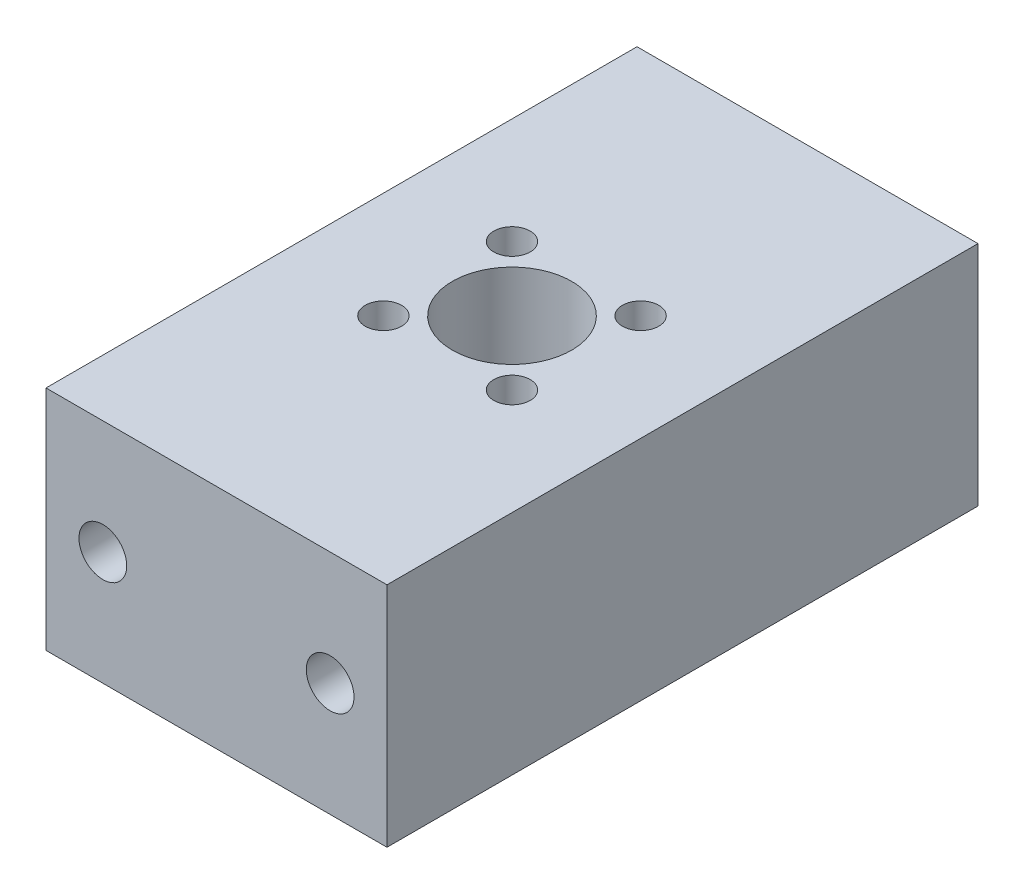
ISO-10303-21;
HEADER;
FILE_DESCRIPTION(('STEP AP214'),'2;1');
FILE_NAME('part.step','',(''),(''),'','','');
FILE_SCHEMA(('AUTOMOTIVE_DESIGN { 1 0 10303 214 1 1 1 1 }'));
ENDSEC;
DATA;
#1=APPLICATION_CONTEXT('core data for automotive mechanical design processes');
#2=APPLICATION_PROTOCOL_DEFINITION('international standard','automotive_design',2000,#1);
#3=PRODUCT_CONTEXT('',#1,'mechanical');
#4=PRODUCT('Part','Part','',(#3));
#5=PRODUCT_RELATED_PRODUCT_CATEGORY('part','',(#4));
#6=PRODUCT_DEFINITION_FORMATION('','',#4);
#7=PRODUCT_DEFINITION_CONTEXT('part definition',#1,'design');
#8=PRODUCT_DEFINITION('design','',#6,#7);
#9=PRODUCT_DEFINITION_SHAPE('','',#8);
#10=(LENGTH_UNIT() NAMED_UNIT(*) SI_UNIT(.MILLI.,.METRE.));
#11=(NAMED_UNIT(*) PLANE_ANGLE_UNIT() SI_UNIT($,.RADIAN.));
#12=(NAMED_UNIT(*) SI_UNIT($,.STERADIAN.) SOLID_ANGLE_UNIT());
#13=UNCERTAINTY_MEASURE_WITH_UNIT(LENGTH_MEASURE(1.E-05),#10,'distance_accuracy_value','');
#14=(GEOMETRIC_REPRESENTATION_CONTEXT(3) GLOBAL_UNCERTAINTY_ASSIGNED_CONTEXT((#13)) GLOBAL_UNIT_ASSIGNED_CONTEXT((#10,
#11,#12)) REPRESENTATION_CONTEXT('',''));
#15=CARTESIAN_POINT('',(0.,0.,0.));
#16=DIRECTION('',(0.,0.,1.));
#17=DIRECTION('',(1.,0.,0.));
#18=AXIS2_PLACEMENT_3D('',#15,#16,#17);
#19=CARTESIAN_POINT('',(0.,0.,52.));
#20=DIRECTION('',(0.,0.,-1.));
#21=DIRECTION('',(-1.,0.,0.));
#22=AXIS2_PLACEMENT_3D('',#19,#20,#21);
#23=PLANE('',#22);
#24=DIRECTION('',(0.,-1.,0.));
#25=VECTOR('',#24,1.);
#26=CARTESIAN_POINT('',(0.,0.,52.));
#27=LINE('',#26,#25);
#28=CARTESIAN_POINT('',(0.,20.,52.));
#29=VERTEX_POINT('',#28);
#30=CARTESIAN_POINT('',(0.,0.,52.));
#31=VERTEX_POINT('',#30);
#32=EDGE_CURVE('E92',#29,#31,#27,.T.);
#33=ORIENTED_EDGE('',*,*,#32,.T.);
#34=DIRECTION('',(1.,0.,0.));
#35=VECTOR('',#34,1.);
#36=CARTESIAN_POINT('',(0.,0.,52.));
#37=LINE('',#36,#35);
#38=CARTESIAN_POINT('',(30.,0.,52.));
#39=VERTEX_POINT('',#38);
#40=EDGE_CURVE('E87',#31,#39,#37,.T.);
#41=ORIENTED_EDGE('',*,*,#40,.T.);
#42=DIRECTION('',(0.,1.,0.));
#43=VECTOR('',#42,1.);
#44=CARTESIAN_POINT('',(30.,0.,52.));
#45=LINE('',#44,#43);
#46=CARTESIAN_POINT('',(30.,20.,52.));
#47=VERTEX_POINT('',#46);
#48=EDGE_CURVE('E90',#39,#47,#45,.T.);
#49=ORIENTED_EDGE('',*,*,#48,.T.);
#50=DIRECTION('',(-1.,0.,0.));
#51=VECTOR('',#50,1.);
#52=CARTESIAN_POINT('',(0.,20.,52.));
#53=LINE('',#52,#51);
#54=EDGE_CURVE('E57',#47,#29,#53,.T.);
#55=ORIENTED_EDGE('',*,*,#54,.T.);
#56=EDGE_LOOP('',(#33,#41,#49,#55));
#57=FACE_BOUND('',#56,.T.);
#58=CARTESIAN_POINT('',(5.,10.,52.));
#59=DIRECTION('',(0.,0.,1.));
#60=DIRECTION('',(1.,0.,0.));
#61=AXIS2_PLACEMENT_3D('',#58,#59,#60);
#62=CIRCLE('',#61,2.1);
#63=CARTESIAN_POINT('',(2.9,10.,52.));
#64=VERTEX_POINT('',#63);
#65=EDGE_CURVE('E112',#64,#64,#62,.T.);
#66=ORIENTED_EDGE('',*,*,#65,.F.);
#67=EDGE_LOOP('',(#66));
#68=FACE_BOUND('',#67,.T.);
#69=CARTESIAN_POINT('',(25.,10.,52.));
#70=DIRECTION('',(0.,0.,1.));
#71=DIRECTION('',(1.,0.,0.));
#72=AXIS2_PLACEMENT_3D('',#69,#70,#71);
#73=CIRCLE('',#72,2.1);
#74=CARTESIAN_POINT('',(22.9,10.,52.));
#75=VERTEX_POINT('',#74);
#76=EDGE_CURVE('E134',#75,#75,#73,.T.);
#77=ORIENTED_EDGE('',*,*,#76,.F.);
#78=EDGE_LOOP('',(#77));
#79=FACE_BOUND('',#78,.T.);
#80=ADVANCED_FACE('F39',(#57,#68,#79),#23,.F.);
#81=CARTESIAN_POINT('',(0.,0.,0.));
#82=DIRECTION('',(0.,0.,-1.));
#83=DIRECTION('',(-1.,0.,0.));
#84=AXIS2_PLACEMENT_3D('',#81,#82,#83);
#85=PLANE('',#84);
#86=CARTESIAN_POINT('',(5.,10.,0.));
#87=DIRECTION('',(0.,0.,1.));
#88=DIRECTION('',(1.,0.,0.));
#89=AXIS2_PLACEMENT_3D('',#86,#87,#88);
#90=CIRCLE('',#89,2.1);
#91=CARTESIAN_POINT('',(2.9,10.,0.));
#92=VERTEX_POINT('',#91);
#93=EDGE_CURVE('E130',#92,#92,#90,.T.);
#94=ORIENTED_EDGE('',*,*,#93,.T.);
#95=EDGE_LOOP('',(#94));
#96=FACE_BOUND('',#95,.T.);
#97=DIRECTION('',(0.,-1.,0.));
#98=VECTOR('',#97,1.);
#99=CARTESIAN_POINT('',(0.,0.,0.));
#100=LINE('',#99,#98);
#101=CARTESIAN_POINT('',(0.,20.,0.));
#102=VERTEX_POINT('',#101);
#103=CARTESIAN_POINT('',(0.,0.,0.));
#104=VERTEX_POINT('',#103);
#105=EDGE_CURVE('E108',#102,#104,#100,.T.);
#106=ORIENTED_EDGE('',*,*,#105,.F.);
#107=DIRECTION('',(-1.,0.,0.));
#108=VECTOR('',#107,1.);
#109=CARTESIAN_POINT('',(0.,20.,0.));
#110=LINE('',#109,#108);
#111=CARTESIAN_POINT('',(30.,20.,0.));
#112=VERTEX_POINT('',#111);
#113=EDGE_CURVE('E80',#112,#102,#110,.T.);
#114=ORIENTED_EDGE('',*,*,#113,.F.);
#115=DIRECTION('',(0.,1.,0.));
#116=VECTOR('',#115,1.);
#117=CARTESIAN_POINT('',(30.,0.,0.));
#118=LINE('',#117,#116);
#119=CARTESIAN_POINT('',(30.,0.,0.));
#120=VERTEX_POINT('',#119);
#121=EDGE_CURVE('E74',#120,#112,#118,.T.);
#122=ORIENTED_EDGE('',*,*,#121,.F.);
#123=DIRECTION('',(1.,0.,0.));
#124=VECTOR('',#123,1.);
#125=CARTESIAN_POINT('',(0.,0.,0.));
#126=LINE('',#125,#124);
#127=EDGE_CURVE('E97',#104,#120,#126,.T.);
#128=ORIENTED_EDGE('',*,*,#127,.F.);
#129=EDGE_LOOP('',(#106,#114,#122,#128));
#130=FACE_BOUND('',#129,.T.);
#131=CARTESIAN_POINT('',(25.,10.,0.));
#132=DIRECTION('',(0.,0.,1.));
#133=DIRECTION('',(1.,0.,0.));
#134=AXIS2_PLACEMENT_3D('',#131,#132,#133);
#135=CIRCLE('',#134,2.1);
#136=CARTESIAN_POINT('',(22.9,10.,0.));
#137=VERTEX_POINT('',#136);
#138=EDGE_CURVE('E138',#137,#137,#135,.T.);
#139=ORIENTED_EDGE('',*,*,#138,.T.);
#140=EDGE_LOOP('',(#139));
#141=FACE_BOUND('',#140,.T.);
#142=ADVANCED_FACE('F125',(#96,#130,#141),#85,.T.);
#143=CARTESIAN_POINT('',(0.,0.,52.));
#144=DIRECTION('',(1.,0.,0.));
#145=DIRECTION('',(0.,0.,-1.));
#146=AXIS2_PLACEMENT_3D('',#143,#144,#145);
#147=PLANE('',#146);
#148=ORIENTED_EDGE('',*,*,#105,.T.);
#149=DIRECTION('',(0.,0.,-1.));
#150=VECTOR('',#149,1.);
#151=CARTESIAN_POINT('',(0.,0.,52.));
#152=LINE('',#151,#150);
#153=EDGE_CURVE('E11',#31,#104,#152,.T.);
#154=ORIENTED_EDGE('',*,*,#153,.F.);
#155=ORIENTED_EDGE('',*,*,#32,.F.);
#156=DIRECTION('',(0.,0.,-1.));
#157=VECTOR('',#156,1.);
#158=CARTESIAN_POINT('',(0.,20.,52.));
#159=LINE('',#158,#157);
#160=EDGE_CURVE('E104',#29,#102,#159,.T.);
#161=ORIENTED_EDGE('',*,*,#160,.T.);
#162=EDGE_LOOP('',(#148,#154,#155,#161));
#163=FACE_BOUND('',#162,.T.);
#164=ADVANCED_FACE('F41',(#163),#147,.F.);
#165=CARTESIAN_POINT('',(0.,0.,52.));
#166=DIRECTION('',(0.,1.,0.));
#167=DIRECTION('',(-1.,0.,0.));
#168=AXIS2_PLACEMENT_3D('',#165,#166,#167);
#169=PLANE('',#168);
#170=CARTESIAN_POINT('',(20.6568542494924,0.,20.3431457505076));
#171=DIRECTION('',(0.,1.,0.));
#172=DIRECTION('',(0.,0.,1.));
#173=AXIS2_PLACEMENT_3D('',#170,#171,#172);
#174=CIRCLE('',#173,1.6);
#175=CARTESIAN_POINT('',(20.6568542494924,0.,21.9431457505076));
#176=VERTEX_POINT('',#175);
#177=EDGE_CURVE('E158',#176,#176,#174,.T.);
#178=ORIENTED_EDGE('',*,*,#177,.T.);
#179=EDGE_LOOP('',(#178));
#180=FACE_BOUND('',#179,.T.);
#181=CARTESIAN_POINT('',(20.6568542494924,0.,31.6568542494924));
#182=DIRECTION('',(0.,1.,0.));
#183=DIRECTION('',(0.,0.,1.));
#184=AXIS2_PLACEMENT_3D('',#181,#182,#183);
#185=CIRCLE('',#184,1.6);
#186=CARTESIAN_POINT('',(20.6568542494924,0.,33.2568542494924));
#187=VERTEX_POINT('',#186);
#188=EDGE_CURVE('E166',#187,#187,#185,.T.);
#189=ORIENTED_EDGE('',*,*,#188,.T.);
#190=EDGE_LOOP('',(#189));
#191=FACE_BOUND('',#190,.T.);
#192=CARTESIAN_POINT('',(9.34314575050761,0.,20.3431457505076));
#193=DIRECTION('',(0.,1.,0.));
#194=DIRECTION('',(0.,0.,1.));
#195=AXIS2_PLACEMENT_3D('',#192,#193,#194);
#196=CIRCLE('',#195,1.6);
#197=CARTESIAN_POINT('',(9.34314575050761,0.,21.9431457505076));
#198=VERTEX_POINT('',#197);
#199=EDGE_CURVE('E174',#198,#198,#196,.T.);
#200=ORIENTED_EDGE('',*,*,#199,.T.);
#201=EDGE_LOOP('',(#200));
#202=FACE_BOUND('',#201,.T.);
#203=CARTESIAN_POINT('',(9.34314575050761,0.,31.6568542494924));
#204=DIRECTION('',(0.,1.,0.));
#205=DIRECTION('',(0.,0.,1.));
#206=AXIS2_PLACEMENT_3D('',#203,#204,#205);
#207=CIRCLE('',#206,1.6);
#208=CARTESIAN_POINT('',(9.34314575050761,0.,33.2568542494924));
#209=VERTEX_POINT('',#208);
#210=EDGE_CURVE('E150',#209,#209,#207,.T.);
#211=ORIENTED_EDGE('',*,*,#210,.T.);
#212=EDGE_LOOP('',(#211));
#213=FACE_BOUND('',#212,.T.);
#214=CARTESIAN_POINT('',(15.,0.,26.));
#215=DIRECTION('',(0.,1.,0.));
#216=DIRECTION('',(0.,0.,1.));
#217=AXIS2_PLACEMENT_3D('',#214,#215,#216);
#218=CIRCLE('',#217,5.25);
#219=CARTESIAN_POINT('',(15.,0.,31.25));
#220=VERTEX_POINT('',#219);
#221=EDGE_CURVE('E142',#220,#220,#218,.T.);
#222=ORIENTED_EDGE('',*,*,#221,.T.);
#223=EDGE_LOOP('',(#222));
#224=FACE_BOUND('',#223,.T.);
#225=ORIENTED_EDGE('',*,*,#127,.T.);
#226=DIRECTION('',(0.,0.,-1.));
#227=VECTOR('',#226,1.);
#228=CARTESIAN_POINT('',(30.,0.,52.));
#229=LINE('',#228,#227);
#230=EDGE_CURVE('E49',#39,#120,#229,.T.);
#231=ORIENTED_EDGE('',*,*,#230,.F.);
#232=ORIENTED_EDGE('',*,*,#40,.F.);
#233=ORIENTED_EDGE('',*,*,#153,.T.);
#234=EDGE_LOOP('',(#225,#231,#232,#233));
#235=FACE_BOUND('',#234,.T.);
#236=ADVANCED_FACE('F96',(#180,#191,#202,#213,#224,#235),#169,.F.);
#237=CARTESIAN_POINT('',(30.,0.,52.));
#238=DIRECTION('',(-1.,0.,0.));
#239=DIRECTION('',(0.,-1.,0.));
#240=AXIS2_PLACEMENT_3D('',#237,#238,#239);
#241=PLANE('',#240);
#242=ORIENTED_EDGE('',*,*,#121,.T.);
#243=DIRECTION('',(0.,0.,-1.));
#244=VECTOR('',#243,1.);
#245=CARTESIAN_POINT('',(30.,20.,52.));
#246=LINE('',#245,#244);
#247=EDGE_CURVE('E99',#47,#112,#246,.T.);
#248=ORIENTED_EDGE('',*,*,#247,.F.);
#249=ORIENTED_EDGE('',*,*,#48,.F.);
#250=ORIENTED_EDGE('',*,*,#230,.T.);
#251=EDGE_LOOP('',(#242,#248,#249,#250));
#252=FACE_BOUND('',#251,.T.);
#253=ADVANCED_FACE('F100',(#252),#241,.F.);
#254=CARTESIAN_POINT('',(0.,20.,52.));
#255=DIRECTION('',(0.,-1.,0.));
#256=DIRECTION('',(1.,0.,0.));
#257=AXIS2_PLACEMENT_3D('',#254,#255,#256);
#258=PLANE('',#257);
#259=CARTESIAN_POINT('',(20.6568542494924,20.,20.3431457505076));
#260=DIRECTION('',(0.,1.,0.));
#261=DIRECTION('',(0.,0.,1.));
#262=AXIS2_PLACEMENT_3D('',#259,#260,#261);
#263=CIRCLE('',#262,1.6);
#264=CARTESIAN_POINT('',(20.6568542494924,20.,21.9431457505076));
#265=VERTEX_POINT('',#264);
#266=EDGE_CURVE('E154',#265,#265,#263,.T.);
#267=ORIENTED_EDGE('',*,*,#266,.F.);
#268=EDGE_LOOP('',(#267));
#269=FACE_BOUND('',#268,.T.);
#270=CARTESIAN_POINT('',(20.6568542494924,20.,31.6568542494924));
#271=DIRECTION('',(0.,1.,0.));
#272=DIRECTION('',(0.,0.,1.));
#273=AXIS2_PLACEMENT_3D('',#270,#271,#272);
#274=CIRCLE('',#273,1.6);
#275=CARTESIAN_POINT('',(20.6568542494924,20.,33.2568542494924));
#276=VERTEX_POINT('',#275);
#277=EDGE_CURVE('E162',#276,#276,#274,.T.);
#278=ORIENTED_EDGE('',*,*,#277,.F.);
#279=EDGE_LOOP('',(#278));
#280=FACE_BOUND('',#279,.T.);
#281=CARTESIAN_POINT('',(9.34314575050761,20.,20.3431457505076));
#282=DIRECTION('',(0.,1.,0.));
#283=DIRECTION('',(0.,0.,1.));
#284=AXIS2_PLACEMENT_3D('',#281,#282,#283);
#285=CIRCLE('',#284,1.6);
#286=CARTESIAN_POINT('',(9.34314575050761,20.,21.9431457505076));
#287=VERTEX_POINT('',#286);
#288=EDGE_CURVE('E170',#287,#287,#285,.T.);
#289=ORIENTED_EDGE('',*,*,#288,.F.);
#290=EDGE_LOOP('',(#289));
#291=FACE_BOUND('',#290,.T.);
#292=CARTESIAN_POINT('',(9.34314575050761,20.,31.6568542494924));
#293=DIRECTION('',(0.,1.,0.));
#294=DIRECTION('',(0.,0.,1.));
#295=AXIS2_PLACEMENT_3D('',#292,#293,#294);
#296=CIRCLE('',#295,1.6);
#297=CARTESIAN_POINT('',(9.34314575050761,20.,33.2568542494924));
#298=VERTEX_POINT('',#297);
#299=EDGE_CURVE('E178',#298,#298,#296,.T.);
#300=ORIENTED_EDGE('',*,*,#299,.F.);
#301=EDGE_LOOP('',(#300));
#302=FACE_BOUND('',#301,.T.);
#303=CARTESIAN_POINT('',(15.,20.,26.));
#304=DIRECTION('',(0.,1.,0.));
#305=DIRECTION('',(0.,0.,1.));
#306=AXIS2_PLACEMENT_3D('',#303,#304,#305);
#307=CIRCLE('',#306,5.25);
#308=CARTESIAN_POINT('',(15.,20.,31.25));
#309=VERTEX_POINT('',#308);
#310=EDGE_CURVE('E146',#309,#309,#307,.T.);
#311=ORIENTED_EDGE('',*,*,#310,.F.);
#312=EDGE_LOOP('',(#311));
#313=FACE_BOUND('',#312,.T.);
#314=ORIENTED_EDGE('',*,*,#113,.T.);
#315=ORIENTED_EDGE('',*,*,#160,.F.);
#316=ORIENTED_EDGE('',*,*,#54,.F.);
#317=ORIENTED_EDGE('',*,*,#247,.T.);
#318=EDGE_LOOP('',(#314,#315,#316,#317));
#319=FACE_BOUND('',#318,.T.);
#320=ADVANCED_FACE('F122',(#269,#280,#291,#302,#313,#319),#258,.F.);
#321=CARTESIAN_POINT('',(5.,10.,52.));
#322=DIRECTION('',(0.,0.,-1.));
#323=DIRECTION('',(-1.,0.,0.));
#324=AXIS2_PLACEMENT_3D('',#321,#322,#323);
#325=CYLINDRICAL_SURFACE('',#324,2.1);
#326=CARTESIAN_POINT('',(2.9,10.,52.));
#327=CARTESIAN_POINT('',(2.9,10.,51.4583333333333));
#328=CARTESIAN_POINT('',(2.9,10.,50.9166666666667));
#329=CARTESIAN_POINT('',(2.9,10.,49.8333333333333));
#330=CARTESIAN_POINT('',(2.9,10.,49.2916666666667));
#331=CARTESIAN_POINT('',(2.9,10.,48.2083333333333));
#332=CARTESIAN_POINT('',(2.9,10.,47.6666666666667));
#333=CARTESIAN_POINT('',(2.9,10.,46.5833333333333));
#334=CARTESIAN_POINT('',(2.9,10.,46.0416666666667));
#335=CARTESIAN_POINT('',(2.9,10.,44.9583333333333));
#336=CARTESIAN_POINT('',(2.9,10.,44.4166666666667));
#337=CARTESIAN_POINT('',(2.9,10.,43.3333333333333));
#338=CARTESIAN_POINT('',(2.9,10.,42.7916666666667));
#339=CARTESIAN_POINT('',(2.9,10.,41.7083333333333));
#340=CARTESIAN_POINT('',(2.9,10.,41.1666666666667));
#341=CARTESIAN_POINT('',(2.9,10.,40.0833333333333));
#342=CARTESIAN_POINT('',(2.9,10.,39.5416666666667));
#343=CARTESIAN_POINT('',(2.9,10.,38.4583333333333));
#344=CARTESIAN_POINT('',(2.9,10.,37.9166666666667));
#345=CARTESIAN_POINT('',(2.9,10.,36.8333333333333));
#346=CARTESIAN_POINT('',(2.9,10.,36.2916666666667));
#347=CARTESIAN_POINT('',(2.9,10.,35.2083333333333));
#348=CARTESIAN_POINT('',(2.9,10.,34.6666666666667));
#349=CARTESIAN_POINT('',(2.9,10.,33.5833333333333));
#350=CARTESIAN_POINT('',(2.9,10.,33.0416666666667));
#351=CARTESIAN_POINT('',(2.9,10.,31.9583333333333));
#352=CARTESIAN_POINT('',(2.9,10.,31.4166666666667));
#353=CARTESIAN_POINT('',(2.9,10.,30.3333333333333));
#354=CARTESIAN_POINT('',(2.9,10.,29.7916666666667));
#355=CARTESIAN_POINT('',(2.9,10.,28.7083333333333));
#356=CARTESIAN_POINT('',(2.9,10.,28.1666666666667));
#357=CARTESIAN_POINT('',(2.9,10.,27.0833333333333));
#358=CARTESIAN_POINT('',(2.9,10.,26.5416666666667));
#359=CARTESIAN_POINT('',(2.9,10.,25.4583333333333));
#360=CARTESIAN_POINT('',(2.9,10.,24.9166666666667));
#361=CARTESIAN_POINT('',(2.9,10.,23.8333333333333));
#362=CARTESIAN_POINT('',(2.9,10.,23.2916666666667));
#363=CARTESIAN_POINT('',(2.9,10.,22.2083333333333));
#364=CARTESIAN_POINT('',(2.9,10.,21.6666666666667));
#365=CARTESIAN_POINT('',(2.9,10.,20.5833333333333));
#366=CARTESIAN_POINT('',(2.9,10.,20.0416666666667));
#367=CARTESIAN_POINT('',(2.9,10.,18.9583333333333));
#368=CARTESIAN_POINT('',(2.9,10.,18.4166666666667));
#369=CARTESIAN_POINT('',(2.9,10.,17.3333333333333));
#370=CARTESIAN_POINT('',(2.9,10.,16.7916666666667));
#371=CARTESIAN_POINT('',(2.9,10.,15.7083333333333));
#372=CARTESIAN_POINT('',(2.9,10.,15.1666666666667));
#373=CARTESIAN_POINT('',(2.9,10.,14.0833333333333));
#374=CARTESIAN_POINT('',(2.9,10.,13.5416666666667));
#375=CARTESIAN_POINT('',(2.9,10.,12.4583333333333));
#376=CARTESIAN_POINT('',(2.9,10.,11.9166666666667));
#377=CARTESIAN_POINT('',(2.9,10.,10.8333333333333));
#378=CARTESIAN_POINT('',(2.9,10.,10.2916666666667));
#379=CARTESIAN_POINT('',(2.9,10.,9.20833333333333));
#380=CARTESIAN_POINT('',(2.9,10.,8.66666666666667));
#381=CARTESIAN_POINT('',(2.9,10.,7.58333333333333));
#382=CARTESIAN_POINT('',(2.9,10.,7.04166666666667));
#383=CARTESIAN_POINT('',(2.9,10.,5.95833333333333));
#384=CARTESIAN_POINT('',(2.9,10.,5.41666666666667));
#385=CARTESIAN_POINT('',(2.9,10.,4.33333333333333));
#386=CARTESIAN_POINT('',(2.9,10.,3.79166666666667));
#387=CARTESIAN_POINT('',(2.9,10.,2.70833333333334));
#388=CARTESIAN_POINT('',(2.9,10.,2.16666666666667));
#389=CARTESIAN_POINT('',(2.9,10.,1.08333333333333));
#390=CARTESIAN_POINT('',(2.9,10.,0.541666666666667));
#391=CARTESIAN_POINT('',(2.9,10.,0.));
#392=B_SPLINE_CURVE_WITH_KNOTS('',3,(#326,#327,#328,#329,#330,#331,#332,#333,#334,#335,#336,
#337,#338,#339,#340,#341,#342,#343,#344,#345,#346,#347,#348,#349,#350,#351,#352,#353,#354,#355,
#356,#357,#358,#359,#360,#361,#362,#363,#364,#365,#366,#367,#368,#369,#370,#371,#372,#373,#374,
#375,#376,#377,#378,#379,#380,#381,#382,#383,#384,#385,#386,#387,#388,#389,#390,#391),
.UNSPECIFIED.,.F.,.F.,(4,2,2,2,2,2,2,2,2,2,2,2,2,2,2,2,2,2,2,2,2,2,2,2,2,2,2,2,2,2,2,2,4),(0.,
1.625,3.25,4.875,6.50000000000001,8.125,9.75,11.375,13.,14.625,16.25,17.875,19.5,21.125,22.75,
24.375,26.,27.625,29.25,30.875,32.5,34.125,35.75,37.375,39.,40.625,42.25,43.875,45.5,47.125,
48.75,50.375,52.),.UNSPECIFIED.);
#393=EDGE_CURVE('BSEAM198',#64,#92,#392,.T.);
#394=ORIENTED_EDGE('',*,*,#65,.T.);
#395=ORIENTED_EDGE('',*,*,#93,.F.);
#396=ORIENTED_EDGE('',*,*,#393,.T.);
#397=ORIENTED_EDGE('',*,*,#393,.F.);
#398=EDGE_LOOP('',(#394,#396,#395,#397));
#399=FACE_BOUND('',#398,.T.);
#400=ADVANCED_FACE('F198',(#399),#325,.F.);
#401=CARTESIAN_POINT('',(25.,10.,52.));
#402=DIRECTION('',(0.,0.,-1.));
#403=DIRECTION('',(-1.,0.,0.));
#404=AXIS2_PLACEMENT_3D('',#401,#402,#403);
#405=CYLINDRICAL_SURFACE('',#404,2.1);
#406=CARTESIAN_POINT('',(22.9,10.,52.));
#407=CARTESIAN_POINT('',(22.9,10.,51.4583333333333));
#408=CARTESIAN_POINT('',(22.9,10.,50.9166666666667));
#409=CARTESIAN_POINT('',(22.9,10.,49.8333333333333));
#410=CARTESIAN_POINT('',(22.9,10.,49.2916666666667));
#411=CARTESIAN_POINT('',(22.9,10.,48.2083333333333));
#412=CARTESIAN_POINT('',(22.9,10.,47.6666666666667));
#413=CARTESIAN_POINT('',(22.9,10.,46.5833333333333));
#414=CARTESIAN_POINT('',(22.9,10.,46.0416666666667));
#415=CARTESIAN_POINT('',(22.9,10.,44.9583333333333));
#416=CARTESIAN_POINT('',(22.9,10.,44.4166666666667));
#417=CARTESIAN_POINT('',(22.9,10.,43.3333333333333));
#418=CARTESIAN_POINT('',(22.9,10.,42.7916666666667));
#419=CARTESIAN_POINT('',(22.9,10.,41.7083333333333));
#420=CARTESIAN_POINT('',(22.9,10.,41.1666666666667));
#421=CARTESIAN_POINT('',(22.9,10.,40.0833333333333));
#422=CARTESIAN_POINT('',(22.9,10.,39.5416666666667));
#423=CARTESIAN_POINT('',(22.9,10.,38.4583333333333));
#424=CARTESIAN_POINT('',(22.9,10.,37.9166666666667));
#425=CARTESIAN_POINT('',(22.9,10.,36.8333333333333));
#426=CARTESIAN_POINT('',(22.9,10.,36.2916666666667));
#427=CARTESIAN_POINT('',(22.9,10.,35.2083333333333));
#428=CARTESIAN_POINT('',(22.9,10.,34.6666666666667));
#429=CARTESIAN_POINT('',(22.9,10.,33.5833333333333));
#430=CARTESIAN_POINT('',(22.9,10.,33.0416666666667));
#431=CARTESIAN_POINT('',(22.9,10.,31.9583333333333));
#432=CARTESIAN_POINT('',(22.9,10.,31.4166666666667));
#433=CARTESIAN_POINT('',(22.9,10.,30.3333333333333));
#434=CARTESIAN_POINT('',(22.9,10.,29.7916666666667));
#435=CARTESIAN_POINT('',(22.9,10.,28.7083333333333));
#436=CARTESIAN_POINT('',(22.9,10.,28.1666666666667));
#437=CARTESIAN_POINT('',(22.9,10.,27.0833333333333));
#438=CARTESIAN_POINT('',(22.9,10.,26.5416666666667));
#439=CARTESIAN_POINT('',(22.9,10.,25.4583333333333));
#440=CARTESIAN_POINT('',(22.9,10.,24.9166666666667));
#441=CARTESIAN_POINT('',(22.9,10.,23.8333333333333));
#442=CARTESIAN_POINT('',(22.9,10.,23.2916666666667));
#443=CARTESIAN_POINT('',(22.9,10.,22.2083333333333));
#444=CARTESIAN_POINT('',(22.9,10.,21.6666666666667));
#445=CARTESIAN_POINT('',(22.9,10.,20.5833333333333));
#446=CARTESIAN_POINT('',(22.9,10.,20.0416666666667));
#447=CARTESIAN_POINT('',(22.9,10.,18.9583333333333));
#448=CARTESIAN_POINT('',(22.9,10.,18.4166666666667));
#449=CARTESIAN_POINT('',(22.9,10.,17.3333333333333));
#450=CARTESIAN_POINT('',(22.9,10.,16.7916666666667));
#451=CARTESIAN_POINT('',(22.9,10.,15.7083333333333));
#452=CARTESIAN_POINT('',(22.9,10.,15.1666666666667));
#453=CARTESIAN_POINT('',(22.9,10.,14.0833333333333));
#454=CARTESIAN_POINT('',(22.9,10.,13.5416666666667));
#455=CARTESIAN_POINT('',(22.9,10.,12.4583333333333));
#456=CARTESIAN_POINT('',(22.9,10.,11.9166666666667));
#457=CARTESIAN_POINT('',(22.9,10.,10.8333333333333));
#458=CARTESIAN_POINT('',(22.9,10.,10.2916666666667));
#459=CARTESIAN_POINT('',(22.9,10.,9.20833333333333));
#460=CARTESIAN_POINT('',(22.9,10.,8.66666666666667));
#461=CARTESIAN_POINT('',(22.9,10.,7.58333333333333));
#462=CARTESIAN_POINT('',(22.9,10.,7.04166666666667));
#463=CARTESIAN_POINT('',(22.9,10.,5.95833333333333));
#464=CARTESIAN_POINT('',(22.9,10.,5.41666666666667));
#465=CARTESIAN_POINT('',(22.9,10.,4.33333333333333));
#466=CARTESIAN_POINT('',(22.9,10.,3.79166666666667));
#467=CARTESIAN_POINT('',(22.9,10.,2.70833333333334));
#468=CARTESIAN_POINT('',(22.9,10.,2.16666666666667));
#469=CARTESIAN_POINT('',(22.9,10.,1.08333333333333));
#470=CARTESIAN_POINT('',(22.9,10.,0.541666666666667));
#471=CARTESIAN_POINT('',(22.9,10.,0.));
#472=B_SPLINE_CURVE_WITH_KNOTS('',3,(#406,#407,#408,#409,#410,#411,#412,#413,#414,#415,#416,
#417,#418,#419,#420,#421,#422,#423,#424,#425,#426,#427,#428,#429,#430,#431,#432,#433,#434,#435,
#436,#437,#438,#439,#440,#441,#442,#443,#444,#445,#446,#447,#448,#449,#450,#451,#452,#453,#454,
#455,#456,#457,#458,#459,#460,#461,#462,#463,#464,#465,#466,#467,#468,#469,#470,#471),
.UNSPECIFIED.,.F.,.F.,(4,2,2,2,2,2,2,2,2,2,2,2,2,2,2,2,2,2,2,2,2,2,2,2,2,2,2,2,2,2,2,2,4),(0.,
1.625,3.25,4.875,6.50000000000001,8.125,9.75,11.375,13.,14.625,16.25,17.875,19.5,21.125,22.75,
24.375,26.,27.625,29.25,30.875,32.5,34.125,35.75,37.375,39.,40.625,42.25,43.875,45.5,47.125,
48.75,50.375,52.),.UNSPECIFIED.);
#473=EDGE_CURVE('BSEAM204',#75,#137,#472,.T.);
#474=ORIENTED_EDGE('',*,*,#76,.T.);
#475=ORIENTED_EDGE('',*,*,#138,.F.);
#476=ORIENTED_EDGE('',*,*,#473,.T.);
#477=ORIENTED_EDGE('',*,*,#473,.F.);
#478=EDGE_LOOP('',(#474,#476,#475,#477));
#479=FACE_BOUND('',#478,.T.);
#480=ADVANCED_FACE('F204',(#479),#405,.F.);
#481=CARTESIAN_POINT('',(15.,0.,26.));
#482=DIRECTION('',(0.,1.,0.));
#483=DIRECTION('',(0.,0.,1.));
#484=AXIS2_PLACEMENT_3D('',#481,#482,#483);
#485=CYLINDRICAL_SURFACE('',#484,5.25);
#486=ORIENTED_EDGE('',*,*,#221,.F.);
#487=EDGE_LOOP('',(#486));
#488=FACE_BOUND('',#487,.T.);
#489=ORIENTED_EDGE('',*,*,#310,.T.);
#490=EDGE_LOOP('',(#489));
#491=FACE_BOUND('',#490,.T.);
#492=ADVANCED_FACE('F192',(#488,#491),#485,.F.);
#493=CARTESIAN_POINT('',(9.34314575050761,0.,31.6568542494924));
#494=DIRECTION('',(0.,1.,0.));
#495=DIRECTION('',(0.,0.,1.));
#496=AXIS2_PLACEMENT_3D('',#493,#494,#495);
#497=CYLINDRICAL_SURFACE('',#496,1.6);
#498=ORIENTED_EDGE('',*,*,#210,.F.);
#499=EDGE_LOOP('',(#498));
#500=FACE_BOUND('',#499,.T.);
#501=ORIENTED_EDGE('',*,*,#299,.T.);
#502=EDGE_LOOP('',(#501));
#503=FACE_BOUND('',#502,.T.);
#504=ADVANCED_FACE('F188',(#500,#503),#497,.F.);
#505=CARTESIAN_POINT('',(9.34314575050761,0.,20.3431457505076));
#506=DIRECTION('',(0.,1.,0.));
#507=DIRECTION('',(0.,0.,1.));
#508=AXIS2_PLACEMENT_3D('',#505,#506,#507);
#509=CYLINDRICAL_SURFACE('',#508,1.6);
#510=ORIENTED_EDGE('',*,*,#199,.F.);
#511=EDGE_LOOP('',(#510));
#512=FACE_BOUND('',#511,.T.);
#513=ORIENTED_EDGE('',*,*,#288,.T.);
#514=EDGE_LOOP('',(#513));
#515=FACE_BOUND('',#514,.T.);
#516=ADVANCED_FACE('F191',(#512,#515),#509,.F.);
#517=CARTESIAN_POINT('',(20.6568542494924,0.,31.6568542494924));
#518=DIRECTION('',(0.,1.,0.));
#519=DIRECTION('',(0.,0.,1.));
#520=AXIS2_PLACEMENT_3D('',#517,#518,#519);
#521=CYLINDRICAL_SURFACE('',#520,1.6);
#522=ORIENTED_EDGE('',*,*,#188,.F.);
#523=EDGE_LOOP('',(#522));
#524=FACE_BOUND('',#523,.T.);
#525=ORIENTED_EDGE('',*,*,#277,.T.);
#526=EDGE_LOOP('',(#525));
#527=FACE_BOUND('',#526,.T.);
#528=ADVANCED_FACE('F237',(#524,#527),#521,.F.);
#529=CARTESIAN_POINT('',(20.6568542494924,0.,20.3431457505076));
#530=DIRECTION('',(0.,1.,0.));
#531=DIRECTION('',(0.,0.,1.));
#532=AXIS2_PLACEMENT_3D('',#529,#530,#531);
#533=CYLINDRICAL_SURFACE('',#532,1.6);
#534=ORIENTED_EDGE('',*,*,#177,.F.);
#535=EDGE_LOOP('',(#534));
#536=FACE_BOUND('',#535,.T.);
#537=ORIENTED_EDGE('',*,*,#266,.T.);
#538=EDGE_LOOP('',(#537));
#539=FACE_BOUND('',#538,.T.);
#540=ADVANCED_FACE('F244',(#536,#539),#533,.F.);
#541=CLOSED_SHELL('',(#80,#142,#164,#236,#253,#320,#400,#480,#492,#504,#516,#528,#540));
#542=MANIFOLD_SOLID_BREP('B2',#541);
#543=ADVANCED_BREP_SHAPE_REPRESENTATION('',(#18,#542),#14);
#544=SHAPE_DEFINITION_REPRESENTATION(#9,#543);
ENDSEC;
END-ISO-10303-21;
